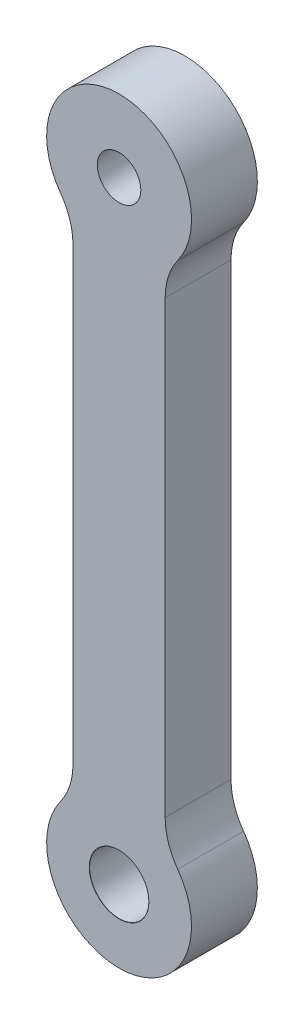
ISO-10303-21;
HEADER;
FILE_DESCRIPTION(('STEP AP214'),'2;1');
FILE_NAME('part.step','',(''),(''),'','','');
FILE_SCHEMA(('AUTOMOTIVE_DESIGN { 1 0 10303 214 1 1 1 1 }'));
ENDSEC;
DATA;
#1=APPLICATION_CONTEXT('core data for automotive mechanical design processes');
#2=APPLICATION_PROTOCOL_DEFINITION('international standard','automotive_design',2000,#1);
#3=PRODUCT_CONTEXT('',#1,'mechanical');
#4=PRODUCT('Part','Part','',(#3));
#5=PRODUCT_RELATED_PRODUCT_CATEGORY('part','',(#4));
#6=PRODUCT_DEFINITION_FORMATION('','',#4);
#7=PRODUCT_DEFINITION_CONTEXT('part definition',#1,'design');
#8=PRODUCT_DEFINITION('design','',#6,#7);
#9=PRODUCT_DEFINITION_SHAPE('','',#8);
#10=(LENGTH_UNIT() NAMED_UNIT(*) SI_UNIT(.MILLI.,.METRE.));
#11=(NAMED_UNIT(*) PLANE_ANGLE_UNIT() SI_UNIT($,.RADIAN.));
#12=(NAMED_UNIT(*) SI_UNIT($,.STERADIAN.) SOLID_ANGLE_UNIT());
#13=UNCERTAINTY_MEASURE_WITH_UNIT(LENGTH_MEASURE(1.E-05),#10,'distance_accuracy_value','');
#14=(GEOMETRIC_REPRESENTATION_CONTEXT(3) GLOBAL_UNCERTAINTY_ASSIGNED_CONTEXT((#13)) GLOBAL_UNIT_ASSIGNED_CONTEXT((#10,
#11,#12)) REPRESENTATION_CONTEXT('',''));
#15=CARTESIAN_POINT('',(0.,0.,0.));
#16=DIRECTION('',(0.,0.,1.));
#17=DIRECTION('',(1.,0.,0.));
#18=AXIS2_PLACEMENT_3D('',#15,#16,#17);
#19=CARTESIAN_POINT('',(0.,46.4852813742386,10.));
#20=DIRECTION('',(0.,0.,-1.));
#21=DIRECTION('',(-1.,0.,0.));
#22=AXIS2_PLACEMENT_3D('',#19,#20,#21);
#23=CYLINDRICAL_SURFACE('',#22,11.);
#24=CARTESIAN_POINT('',(0.,46.4852813742386,10.));
#25=DIRECTION('',(0.,0.,1.));
#26=DIRECTION('',(1.,0.,0.));
#27=AXIS2_PLACEMENT_3D('',#24,#25,#26);
#28=CIRCLE('',#27,11.);
#29=CARTESIAN_POINT('',(8.90476190476191,40.0273238473187,10.));
#30=VERTEX_POINT('',#29);
#31=CARTESIAN_POINT('',(-8.90476190476191,40.0273238473187,10.));
#32=VERTEX_POINT('',#31);
#33=EDGE_CURVE('E131',#30,#32,#28,.T.);
#34=ORIENTED_EDGE('',*,*,#33,.F.);
#35=DIRECTION('',(0.,0.,-1.));
#36=VECTOR('',#35,1.);
#37=CARTESIAN_POINT('',(8.90476190476191,40.0273238473187,10.));
#38=LINE('',#37,#36);
#39=CARTESIAN_POINT('',(8.90476190476191,40.0273238473187,0.));
#40=VERTEX_POINT('',#39);
#41=EDGE_CURVE('E117',#30,#40,#38,.T.);
#42=ORIENTED_EDGE('',*,*,#41,.T.);
#43=CARTESIAN_POINT('',(0.,46.4852813742386,0.));
#44=DIRECTION('',(0.,0.,1.));
#45=DIRECTION('',(1.,0.,0.));
#46=AXIS2_PLACEMENT_3D('',#43,#44,#45);
#47=CIRCLE('',#46,11.);
#48=CARTESIAN_POINT('',(-8.90476190476191,40.0273238473187,0.));
#49=VERTEX_POINT('',#48);
#50=EDGE_CURVE('E129',#40,#49,#47,.T.);
#51=ORIENTED_EDGE('',*,*,#50,.T.);
#52=DIRECTION('',(0.,0.,-1.));
#53=VECTOR('',#52,1.);
#54=CARTESIAN_POINT('',(-8.90476190476191,40.0273238473187,10.));
#55=LINE('',#54,#53);
#56=EDGE_CURVE('E134',#49,#32,#55,.F.);
#57=ORIENTED_EDGE('',*,*,#56,.T.);
#58=EDGE_LOOP('',(#34,#42,#51,#57));
#59=FACE_BOUND('',#58,.T.);
#60=ADVANCED_FACE('F47',(#59),#23,.T.);
#61=CARTESIAN_POINT('',(-7.,38.,10.));
#62=DIRECTION('',(1.,0.,0.));
#63=DIRECTION('',(0.,0.,-1.));
#64=AXIS2_PLACEMENT_3D('',#61,#62,#63);
#65=PLANE('',#64);
#66=DIRECTION('',(0.,-1.,0.));
#67=VECTOR('',#66,1.);
#68=CARTESIAN_POINT('',(-7.,38.,0.));
#69=LINE('',#68,#67);
#70=CARTESIAN_POINT('',(-7.,34.1564533683006,0.));
#71=VERTEX_POINT('',#70);
#72=CARTESIAN_POINT('',(-7.,-34.1564533683006,0.));
#73=VERTEX_POINT('',#72);
#74=EDGE_CURVE('E139',#71,#73,#69,.T.);
#75=ORIENTED_EDGE('',*,*,#74,.T.);
#76=DIRECTION('',(0.,0.,1.));
#77=VECTOR('',#76,1.);
#78=CARTESIAN_POINT('',(-7.,-34.1564533683006,10.));
#79=LINE('',#78,#77);
#80=CARTESIAN_POINT('',(-7.,-34.1564533683006,10.));
#81=VERTEX_POINT('',#80);
#82=EDGE_CURVE('E63',#73,#81,#79,.T.);
#83=ORIENTED_EDGE('',*,*,#82,.T.);
#84=DIRECTION('',(0.,-1.,0.));
#85=VECTOR('',#84,1.);
#86=CARTESIAN_POINT('',(-7.,38.,10.));
#87=LINE('',#86,#85);
#88=CARTESIAN_POINT('',(-7.,34.1564533683006,10.));
#89=VERTEX_POINT('',#88);
#90=EDGE_CURVE('E199',#89,#81,#87,.T.);
#91=ORIENTED_EDGE('',*,*,#90,.F.);
#92=DIRECTION('',(0.,0.,1.));
#93=VECTOR('',#92,1.);
#94=CARTESIAN_POINT('',(-7.,34.1564533683006,0.));
#95=LINE('',#94,#93);
#96=EDGE_CURVE('E173',#89,#71,#95,.F.);
#97=ORIENTED_EDGE('',*,*,#96,.T.);
#98=EDGE_LOOP('',(#75,#83,#91,#97));
#99=FACE_BOUND('',#98,.T.);
#100=ADVANCED_FACE('F243',(#99),#65,.F.);
#101=CARTESIAN_POINT('',(0.,-46.4852813742386,10.));
#102=DIRECTION('',(0.,0.,-1.));
#103=DIRECTION('',(-1.,0.,0.));
#104=AXIS2_PLACEMENT_3D('',#101,#102,#103);
#105=CYLINDRICAL_SURFACE('',#104,11.);
#106=CARTESIAN_POINT('',(0.,-46.4852813742386,0.));
#107=DIRECTION('',(0.,0.,1.));
#108=DIRECTION('',(-1.,0.,0.));
#109=AXIS2_PLACEMENT_3D('',#106,#107,#108);
#110=CIRCLE('',#109,11.);
#111=CARTESIAN_POINT('',(-8.90476190476191,-40.0273238473187,0.));
#112=VERTEX_POINT('',#111);
#113=CARTESIAN_POINT('',(8.90476190476191,-40.0273238473187,0.));
#114=VERTEX_POINT('',#113);
#115=EDGE_CURVE('E144',#112,#114,#110,.T.);
#116=ORIENTED_EDGE('',*,*,#115,.T.);
#117=DIRECTION('',(0.,0.,-1.));
#118=VECTOR('',#117,1.);
#119=CARTESIAN_POINT('',(8.90476190476191,-40.0273238473187,10.));
#120=LINE('',#119,#118);
#121=CARTESIAN_POINT('',(8.90476190476191,-40.0273238473187,10.));
#122=VERTEX_POINT('',#121);
#123=EDGE_CURVE('E170',#114,#122,#120,.F.);
#124=ORIENTED_EDGE('',*,*,#123,.T.);
#125=CARTESIAN_POINT('',(0.,-46.4852813742386,10.));
#126=DIRECTION('',(0.,0.,1.));
#127=DIRECTION('',(-1.,0.,0.));
#128=AXIS2_PLACEMENT_3D('',#125,#126,#127);
#129=CIRCLE('',#128,11.);
#130=CARTESIAN_POINT('',(-8.90476190476191,-40.0273238473187,10.));
#131=VERTEX_POINT('',#130);
#132=EDGE_CURVE('E196',#131,#122,#129,.T.);
#133=ORIENTED_EDGE('',*,*,#132,.F.);
#134=DIRECTION('',(0.,0.,-1.));
#135=VECTOR('',#134,1.);
#136=CARTESIAN_POINT('',(-8.90476190476191,-40.0273238473187,10.));
#137=LINE('',#136,#135);
#138=EDGE_CURVE('E166',#131,#112,#137,.T.);
#139=ORIENTED_EDGE('',*,*,#138,.T.);
#140=EDGE_LOOP('',(#116,#124,#133,#139));
#141=FACE_BOUND('',#140,.T.);
#142=ADVANCED_FACE('F237',(#141),#105,.T.);
#143=CARTESIAN_POINT('',(7.,38.,10.));
#144=DIRECTION('',(-1.,0.,0.));
#145=DIRECTION('',(0.,-1.,0.));
#146=AXIS2_PLACEMENT_3D('',#143,#144,#145);
#147=PLANE('',#146);
#148=DIRECTION('',(0.,1.,0.));
#149=VECTOR('',#148,1.);
#150=CARTESIAN_POINT('',(7.,38.,0.));
#151=LINE('',#150,#149);
#152=CARTESIAN_POINT('',(7.,-34.1564533683006,0.));
#153=VERTEX_POINT('',#152);
#154=CARTESIAN_POINT('',(7.,34.1564533683006,0.));
#155=VERTEX_POINT('',#154);
#156=EDGE_CURVE('E156',#153,#155,#151,.T.);
#157=ORIENTED_EDGE('',*,*,#156,.T.);
#158=DIRECTION('',(0.,0.,1.));
#159=VECTOR('',#158,1.);
#160=CARTESIAN_POINT('',(7.,34.1564533683006,10.));
#161=LINE('',#160,#159);
#162=CARTESIAN_POINT('',(7.,34.1564533683006,10.));
#163=VERTEX_POINT('',#162);
#164=EDGE_CURVE('E118',#155,#163,#161,.T.);
#165=ORIENTED_EDGE('',*,*,#164,.T.);
#166=DIRECTION('',(0.,1.,0.));
#167=VECTOR('',#166,1.);
#168=CARTESIAN_POINT('',(7.,38.,10.));
#169=LINE('',#168,#167);
#170=CARTESIAN_POINT('',(7.,-34.1564533683006,10.));
#171=VERTEX_POINT('',#170);
#172=EDGE_CURVE('E150',#171,#163,#169,.T.);
#173=ORIENTED_EDGE('',*,*,#172,.F.);
#174=DIRECTION('',(0.,0.,1.));
#175=VECTOR('',#174,1.);
#176=CARTESIAN_POINT('',(7.,-34.1564533683006,0.));
#177=LINE('',#176,#175);
#178=EDGE_CURVE('E133',#171,#153,#177,.F.);
#179=ORIENTED_EDGE('',*,*,#178,.T.);
#180=EDGE_LOOP('',(#157,#165,#173,#179));
#181=FACE_BOUND('',#180,.T.);
#182=ADVANCED_FACE('F225',(#181),#147,.F.);
#183=CARTESIAN_POINT('',(0.,46.4852813742386,10.));
#184=DIRECTION('',(0.,0.,1.));
#185=DIRECTION('',(1.,0.,0.));
#186=AXIS2_PLACEMENT_3D('',#183,#184,#185);
#187=PLANE('',#186);
#188=CARTESIAN_POINT('',(0.,46.4852813742386,10.));
#189=DIRECTION('',(0.,0.,1.));
#190=DIRECTION('',(1.,0.,0.));
#191=AXIS2_PLACEMENT_3D('',#188,#189,#190);
#192=CIRCLE('',#191,3.29999999999999);
#193=CARTESIAN_POINT('',(3.29999999999999,46.4852813742386,10.));
#194=VERTEX_POINT('',#193);
#195=EDGE_CURVE('E215',#194,#194,#192,.T.);
#196=ORIENTED_EDGE('',*,*,#195,.F.);
#197=EDGE_LOOP('',(#196));
#198=FACE_BOUND('',#197,.T.);
#199=CARTESIAN_POINT('',(0.,-46.4852813742386,10.));
#200=DIRECTION('',(0.,0.,1.));
#201=DIRECTION('',(1.,0.,0.));
#202=AXIS2_PLACEMENT_3D('',#199,#200,#201);
#203=CIRCLE('',#202,4.525);
#204=CARTESIAN_POINT('',(4.525,-46.4852813742386,10.));
#205=VERTEX_POINT('',#204);
#206=EDGE_CURVE('E207',#205,#205,#203,.T.);
#207=ORIENTED_EDGE('',*,*,#206,.F.);
#208=EDGE_LOOP('',(#207));
#209=FACE_BOUND('',#208,.T.);
#210=ORIENTED_EDGE('',*,*,#172,.T.);
#211=CARTESIAN_POINT('',(17.,34.1564533683006,10.));
#212=DIRECTION('',(0.,0.,1.));
#213=DIRECTION('',(1.,0.,0.));
#214=AXIS2_PLACEMENT_3D('',#211,#212,#213);
#215=CIRCLE('',#214,10.);
#216=EDGE_CURVE('E124',#163,#30,#215,.F.);
#217=ORIENTED_EDGE('',*,*,#216,.T.);
#218=ORIENTED_EDGE('',*,*,#33,.T.);
#219=CARTESIAN_POINT('',(-17.,34.1564533683006,10.));
#220=DIRECTION('',(0.,0.,1.));
#221=DIRECTION('',(1.,0.,0.));
#222=AXIS2_PLACEMENT_3D('',#219,#220,#221);
#223=CIRCLE('',#222,10.);
#224=EDGE_CURVE('E11',#32,#89,#223,.F.);
#225=ORIENTED_EDGE('',*,*,#224,.T.);
#226=ORIENTED_EDGE('',*,*,#90,.T.);
#227=CARTESIAN_POINT('',(-17.,-34.1564533683006,10.));
#228=DIRECTION('',(0.,0.,1.));
#229=DIRECTION('',(1.,0.,0.));
#230=AXIS2_PLACEMENT_3D('',#227,#228,#229);
#231=CIRCLE('',#230,10.);
#232=EDGE_CURVE('E190',#81,#131,#231,.F.);
#233=ORIENTED_EDGE('',*,*,#232,.T.);
#234=ORIENTED_EDGE('',*,*,#132,.T.);
#235=CARTESIAN_POINT('',(17.,-34.1564533683006,10.));
#236=DIRECTION('',(0.,0.,1.));
#237=DIRECTION('',(1.,0.,0.));
#238=AXIS2_PLACEMENT_3D('',#235,#236,#237);
#239=CIRCLE('',#238,10.);
#240=EDGE_CURVE('E184',#122,#171,#239,.F.);
#241=ORIENTED_EDGE('',*,*,#240,.T.);
#242=EDGE_LOOP('',(#210,#217,#218,#225,#226,#233,#234,#241));
#243=FACE_BOUND('',#242,.T.);
#244=ADVANCED_FACE('F222',(#198,#209,#243),#187,.T.);
#245=CARTESIAN_POINT('',(0.,46.4852813742386,0.));
#246=DIRECTION('',(0.,0.,1.));
#247=DIRECTION('',(1.,0.,0.));
#248=AXIS2_PLACEMENT_3D('',#245,#246,#247);
#249=PLANE('',#248);
#250=CARTESIAN_POINT('',(0.,46.4852813742386,0.));
#251=DIRECTION('',(0.,0.,1.));
#252=DIRECTION('',(1.,0.,0.));
#253=AXIS2_PLACEMENT_3D('',#250,#251,#252);
#254=CIRCLE('',#253,3.29999999999999);
#255=CARTESIAN_POINT('',(3.29999999999999,46.4852813742386,0.));
#256=VERTEX_POINT('',#255);
#257=EDGE_CURVE('E211',#256,#256,#254,.T.);
#258=ORIENTED_EDGE('',*,*,#257,.T.);
#259=EDGE_LOOP('',(#258));
#260=FACE_BOUND('',#259,.T.);
#261=CARTESIAN_POINT('',(0.,-46.4852813742386,0.));
#262=DIRECTION('',(0.,0.,1.));
#263=DIRECTION('',(1.,0.,0.));
#264=AXIS2_PLACEMENT_3D('',#261,#262,#263);
#265=CIRCLE('',#264,4.5);
#266=CARTESIAN_POINT('',(4.5,-46.4852813742386,0.));
#267=VERTEX_POINT('',#266);
#268=EDGE_CURVE('E140',#267,#267,#265,.T.);
#269=ORIENTED_EDGE('',*,*,#268,.T.);
#270=EDGE_LOOP('',(#269));
#271=FACE_BOUND('',#270,.T.);
#272=ORIENTED_EDGE('',*,*,#50,.F.);
#273=CARTESIAN_POINT('',(17.,34.1564533683006,0.));
#274=DIRECTION('',(0.,0.,1.));
#275=DIRECTION('',(1.,0.,0.));
#276=AXIS2_PLACEMENT_3D('',#273,#274,#275);
#277=CIRCLE('',#276,10.);
#278=EDGE_CURVE('E113',#40,#155,#277,.T.);
#279=ORIENTED_EDGE('',*,*,#278,.T.);
#280=ORIENTED_EDGE('',*,*,#156,.F.);
#281=CARTESIAN_POINT('',(17.,-34.1564533683006,0.));
#282=DIRECTION('',(0.,0.,1.));
#283=DIRECTION('',(1.,0.,0.));
#284=AXIS2_PLACEMENT_3D('',#281,#282,#283);
#285=CIRCLE('',#284,10.);
#286=EDGE_CURVE('E181',#153,#114,#285,.T.);
#287=ORIENTED_EDGE('',*,*,#286,.T.);
#288=ORIENTED_EDGE('',*,*,#115,.F.);
#289=CARTESIAN_POINT('',(-17.,-34.1564533683006,0.));
#290=DIRECTION('',(0.,0.,1.));
#291=DIRECTION('',(1.,0.,0.));
#292=AXIS2_PLACEMENT_3D('',#289,#290,#291);
#293=CIRCLE('',#292,10.);
#294=EDGE_CURVE('E187',#112,#73,#293,.T.);
#295=ORIENTED_EDGE('',*,*,#294,.T.);
#296=ORIENTED_EDGE('',*,*,#74,.F.);
#297=CARTESIAN_POINT('',(-17.,34.1564533683006,0.));
#298=DIRECTION('',(0.,0.,1.));
#299=DIRECTION('',(1.,0.,0.));
#300=AXIS2_PLACEMENT_3D('',#297,#298,#299);
#301=CIRCLE('',#300,10.);
#302=EDGE_CURVE('E56',#71,#49,#301,.T.);
#303=ORIENTED_EDGE('',*,*,#302,.T.);
#304=EDGE_LOOP('',(#272,#279,#280,#287,#288,#295,#296,#303));
#305=FACE_BOUND('',#304,.T.);
#306=ADVANCED_FACE('F136',(#260,#271,#305),#249,.F.);
#307=CARTESIAN_POINT('',(17.,34.1564533683006,10.));
#308=DIRECTION('',(0.,0.,-1.));
#309=DIRECTION('',(-1.,0.,0.));
#310=AXIS2_PLACEMENT_3D('',#307,#308,#309);
#311=CYLINDRICAL_SURFACE('',#310,10.);
#312=ORIENTED_EDGE('',*,*,#216,.F.);
#313=ORIENTED_EDGE('',*,*,#164,.F.);
#314=ORIENTED_EDGE('',*,*,#278,.F.);
#315=ORIENTED_EDGE('',*,*,#41,.F.);
#316=EDGE_LOOP('',(#312,#313,#314,#315));
#317=FACE_BOUND('',#316,.T.);
#318=ADVANCED_FACE('F116',(#317),#311,.F.);
#319=CARTESIAN_POINT('',(17.,-34.1564533683006,10.));
#320=DIRECTION('',(0.,0.,-1.));
#321=DIRECTION('',(-1.,0.,0.));
#322=AXIS2_PLACEMENT_3D('',#319,#320,#321);
#323=CYLINDRICAL_SURFACE('',#322,10.);
#324=ORIENTED_EDGE('',*,*,#240,.F.);
#325=ORIENTED_EDGE('',*,*,#123,.F.);
#326=ORIENTED_EDGE('',*,*,#286,.F.);
#327=ORIENTED_EDGE('',*,*,#178,.F.);
#328=EDGE_LOOP('',(#324,#325,#326,#327));
#329=FACE_BOUND('',#328,.T.);
#330=ADVANCED_FACE('F233',(#329),#323,.F.);
#331=CARTESIAN_POINT('',(-17.,-34.1564533683006,10.));
#332=DIRECTION('',(0.,0.,-1.));
#333=DIRECTION('',(-1.,0.,0.));
#334=AXIS2_PLACEMENT_3D('',#331,#332,#333);
#335=CYLINDRICAL_SURFACE('',#334,10.);
#336=ORIENTED_EDGE('',*,*,#232,.F.);
#337=ORIENTED_EDGE('',*,*,#82,.F.);
#338=ORIENTED_EDGE('',*,*,#294,.F.);
#339=ORIENTED_EDGE('',*,*,#138,.F.);
#340=EDGE_LOOP('',(#336,#337,#338,#339));
#341=FACE_BOUND('',#340,.T.);
#342=ADVANCED_FACE('F242',(#341),#335,.F.);
#343=CARTESIAN_POINT('',(-17.,34.1564533683006,10.));
#344=DIRECTION('',(0.,0.,-1.));
#345=DIRECTION('',(-1.,0.,0.));
#346=AXIS2_PLACEMENT_3D('',#343,#344,#345);
#347=CYLINDRICAL_SURFACE('',#346,10.);
#348=ORIENTED_EDGE('',*,*,#224,.F.);
#349=ORIENTED_EDGE('',*,*,#56,.F.);
#350=ORIENTED_EDGE('',*,*,#302,.F.);
#351=ORIENTED_EDGE('',*,*,#96,.F.);
#352=EDGE_LOOP('',(#348,#349,#350,#351));
#353=FACE_BOUND('',#352,.T.);
#354=ADVANCED_FACE('F49',(#353),#347,.F.);
#355=CARTESIAN_POINT('',(0.,-46.4852813742386,10.));
#356=DIRECTION('',(0.,0.,1.));
#357=DIRECTION('',(1.,0.,0.));
#358=AXIS2_PLACEMENT_3D('',#355,#356,#357);
#359=CYLINDRICAL_SURFACE('',#358,4.5);
#360=ORIENTED_EDGE('',*,*,#268,.F.);
#361=EDGE_LOOP('',(#360));
#362=FACE_BOUND('',#361,.T.);
#363=CARTESIAN_POINT('',(0.,-46.4852813742386,9.975));
#364=DIRECTION('',(0.,0.,1.));
#365=DIRECTION('',(1.,0.,0.));
#366=AXIS2_PLACEMENT_3D('',#363,#364,#365);
#367=CIRCLE('',#366,4.5);
#368=CARTESIAN_POINT('',(4.5,-46.4852813742386,9.975));
#369=VERTEX_POINT('',#368);
#370=EDGE_CURVE('E147',#369,#369,#367,.T.);
#371=ORIENTED_EDGE('',*,*,#370,.T.);
#372=EDGE_LOOP('',(#371));
#373=FACE_BOUND('',#372,.T.);
#374=ADVANCED_FACE('F247',(#362,#373),#359,.F.);
#375=CARTESIAN_POINT('',(0.,-46.4852813742386,10.));
#376=DIRECTION('',(0.,0.,1.));
#377=DIRECTION('',(1.,0.,0.));
#378=AXIS2_PLACEMENT_3D('',#375,#376,#377);
#379=CONICAL_SURFACE('',#378,4.525,0.785398163397414);
#380=ORIENTED_EDGE('',*,*,#370,.F.);
#381=EDGE_LOOP('',(#380));
#382=FACE_BOUND('',#381,.T.);
#383=ORIENTED_EDGE('',*,*,#206,.T.);
#384=EDGE_LOOP('',(#383));
#385=FACE_BOUND('',#384,.T.);
#386=ADVANCED_FACE('F253',(#382,#385),#379,.F.);
#387=CARTESIAN_POINT('',(0.,46.4852813742386,10.));
#388=DIRECTION('',(0.,0.,1.));
#389=DIRECTION('',(1.,0.,0.));
#390=AXIS2_PLACEMENT_3D('',#387,#388,#389);
#391=CYLINDRICAL_SURFACE('',#390,3.29999999999999);
#392=ORIENTED_EDGE('',*,*,#257,.F.);
#393=EDGE_LOOP('',(#392));
#394=FACE_BOUND('',#393,.T.);
#395=ORIENTED_EDGE('',*,*,#195,.T.);
#396=EDGE_LOOP('',(#395));
#397=FACE_BOUND('',#396,.T.);
#398=ADVANCED_FACE('F220',(#394,#397),#391,.F.);
#399=CLOSED_SHELL('',(#60,#100,#142,#182,#244,#306,#318,#330,#342,#354,#374,#386,#398));
#400=MANIFOLD_SOLID_BREP('B2',#399);
#401=ADVANCED_BREP_SHAPE_REPRESENTATION('',(#18,#400),#14);
#402=SHAPE_DEFINITION_REPRESENTATION(#9,#401);
ENDSEC;
END-ISO-10303-21;
